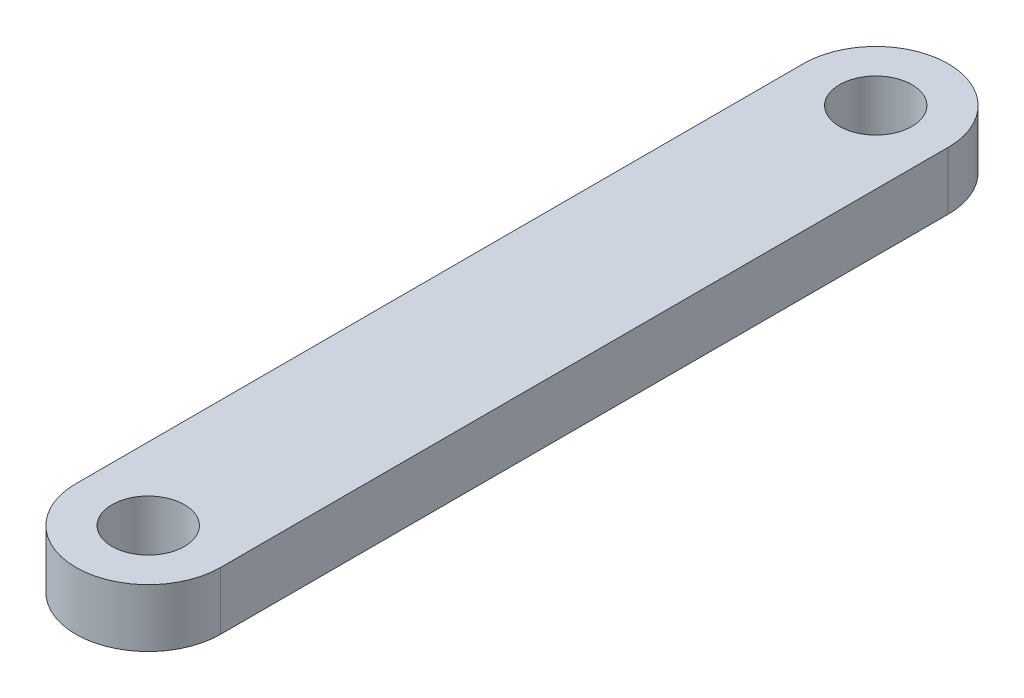
ISO-10303-21;
HEADER;
FILE_DESCRIPTION(('STEP AP214'),'2;1');
FILE_NAME('part.step','',(''),(''),'','','');
FILE_SCHEMA(('AUTOMOTIVE_DESIGN { 1 0 10303 214 1 1 1 1 }'));
ENDSEC;
DATA;
#1=APPLICATION_CONTEXT('core data for automotive mechanical design processes');
#2=APPLICATION_PROTOCOL_DEFINITION('international standard','automotive_design',2000,#1);
#3=PRODUCT_CONTEXT('',#1,'mechanical');
#4=PRODUCT('Part','Part','',(#3));
#5=PRODUCT_RELATED_PRODUCT_CATEGORY('part','',(#4));
#6=PRODUCT_DEFINITION_FORMATION('','',#4);
#7=PRODUCT_DEFINITION_CONTEXT('part definition',#1,'design');
#8=PRODUCT_DEFINITION('design','',#6,#7);
#9=PRODUCT_DEFINITION_SHAPE('','',#8);
#10=(LENGTH_UNIT() NAMED_UNIT(*) SI_UNIT(.MILLI.,.METRE.));
#11=(NAMED_UNIT(*) PLANE_ANGLE_UNIT() SI_UNIT($,.RADIAN.));
#12=(NAMED_UNIT(*) SI_UNIT($,.STERADIAN.) SOLID_ANGLE_UNIT());
#13=UNCERTAINTY_MEASURE_WITH_UNIT(LENGTH_MEASURE(1.E-05),#10,'distance_accuracy_value','');
#14=(GEOMETRIC_REPRESENTATION_CONTEXT(3) GLOBAL_UNCERTAINTY_ASSIGNED_CONTEXT((#13)) GLOBAL_UNIT_ASSIGNED_CONTEXT((#10,
#11,#12)) REPRESENTATION_CONTEXT('',''));
#15=CARTESIAN_POINT('',(0.,0.,0.));
#16=DIRECTION('',(0.,0.,1.));
#17=DIRECTION('',(1.,0.,0.));
#18=AXIS2_PLACEMENT_3D('',#15,#16,#17);
#19=CARTESIAN_POINT('',(0.,2.,0.));
#20=DIRECTION('',(0.,1.,0.));
#21=DIRECTION('',(0.,0.,1.));
#22=AXIS2_PLACEMENT_3D('',#19,#20,#21);
#23=PLANE('',#22);
#24=CARTESIAN_POINT('',(0.,2.,-25.11));
#25=DIRECTION('',(0.,1.,0.));
#26=DIRECTION('',(0.,0.,1.));
#27=AXIS2_PLACEMENT_3D('',#24,#25,#26);
#28=CIRCLE('',#27,1.25);
#29=CARTESIAN_POINT('',(0.,2.,-23.86));
#30=VERTEX_POINT('',#29);
#31=EDGE_CURVE('E103',#30,#30,#28,.T.);
#32=ORIENTED_EDGE('',*,*,#31,.F.);
#33=EDGE_LOOP('',(#32));
#34=FACE_BOUND('',#33,.T.);
#35=CARTESIAN_POINT('',(0.,2.,0.));
#36=DIRECTION('',(0.,1.,0.));
#37=DIRECTION('',(0.,0.,1.));
#38=AXIS2_PLACEMENT_3D('',#35,#36,#37);
#39=CIRCLE('',#38,2.5);
#40=CARTESIAN_POINT('',(-2.50000000000001,2.,0.));
#41=VERTEX_POINT('',#40);
#42=CARTESIAN_POINT('',(2.5,2.,0.));
#43=VERTEX_POINT('',#42);
#44=EDGE_CURVE('E87',#41,#43,#39,.T.);
#45=ORIENTED_EDGE('',*,*,#44,.T.);
#46=DIRECTION('',(0.,0.,-1.));
#47=VECTOR('',#46,1.);
#48=CARTESIAN_POINT('',(2.5,2.,-25.11));
#49=LINE('',#48,#47);
#50=CARTESIAN_POINT('',(2.5,2.,-25.11));
#51=VERTEX_POINT('',#50);
#52=EDGE_CURVE('E82',#43,#51,#49,.T.);
#53=ORIENTED_EDGE('',*,*,#52,.T.);
#54=CARTESIAN_POINT('',(0.,2.,-25.11));
#55=DIRECTION('',(0.,1.,0.));
#56=DIRECTION('',(0.,0.,1.));
#57=AXIS2_PLACEMENT_3D('',#54,#55,#56);
#58=CIRCLE('',#57,2.5);
#59=CARTESIAN_POINT('',(-2.5,2.,-25.11));
#60=VERTEX_POINT('',#59);
#61=EDGE_CURVE('E85',#51,#60,#58,.T.);
#62=ORIENTED_EDGE('',*,*,#61,.T.);
#63=DIRECTION('',(0.,0.,1.));
#64=VECTOR('',#63,1.);
#65=CARTESIAN_POINT('',(-2.50000000000001,2.,0.));
#66=LINE('',#65,#64);
#67=EDGE_CURVE('E52',#60,#41,#66,.T.);
#68=ORIENTED_EDGE('',*,*,#67,.T.);
#69=EDGE_LOOP('',(#45,#53,#62,#68));
#70=FACE_BOUND('',#69,.T.);
#71=CARTESIAN_POINT('',(0.,2.,0.));
#72=DIRECTION('',(0.,1.,0.));
#73=DIRECTION('',(0.,0.,1.));
#74=AXIS2_PLACEMENT_3D('',#71,#72,#73);
#75=CIRCLE('',#74,1.25000000000001);
#76=CARTESIAN_POINT('',(0.,2.,1.25000000000001));
#77=VERTEX_POINT('',#76);
#78=EDGE_CURVE('E113',#77,#77,#75,.T.);
#79=ORIENTED_EDGE('',*,*,#78,.F.);
#80=EDGE_LOOP('',(#79));
#81=FACE_BOUND('',#80,.T.);
#82=ADVANCED_FACE('F33',(#34,#70,#81),#23,.T.);
#83=CARTESIAN_POINT('',(0.,0.,0.));
#84=DIRECTION('',(0.,1.,0.));
#85=DIRECTION('',(0.,0.,1.));
#86=AXIS2_PLACEMENT_3D('',#83,#84,#85);
#87=PLANE('',#86);
#88=CARTESIAN_POINT('',(0.,0.,0.));
#89=DIRECTION('',(0.,1.,0.));
#90=DIRECTION('',(0.,0.,1.));
#91=AXIS2_PLACEMENT_3D('',#88,#89,#90);
#92=CIRCLE('',#91,2.5);
#93=CARTESIAN_POINT('',(-2.50000000000001,0.,0.));
#94=VERTEX_POINT('',#93);
#95=CARTESIAN_POINT('',(2.5,0.,0.));
#96=VERTEX_POINT('',#95);
#97=EDGE_CURVE('E100',#94,#96,#92,.T.);
#98=ORIENTED_EDGE('',*,*,#97,.F.);
#99=DIRECTION('',(0.,0.,1.));
#100=VECTOR('',#99,1.);
#101=CARTESIAN_POINT('',(-2.50000000000001,0.,0.));
#102=LINE('',#101,#100);
#103=CARTESIAN_POINT('',(-2.5,0.,-25.11));
#104=VERTEX_POINT('',#103);
#105=EDGE_CURVE('E75',#104,#94,#102,.T.);
#106=ORIENTED_EDGE('',*,*,#105,.F.);
#107=CARTESIAN_POINT('',(0.,0.,-25.11));
#108=DIRECTION('',(0.,1.,0.));
#109=DIRECTION('',(0.,0.,1.));
#110=AXIS2_PLACEMENT_3D('',#107,#108,#109);
#111=CIRCLE('',#110,2.5);
#112=CARTESIAN_POINT('',(2.5,0.,-25.11));
#113=VERTEX_POINT('',#112);
#114=EDGE_CURVE('E69',#113,#104,#111,.T.);
#115=ORIENTED_EDGE('',*,*,#114,.F.);
#116=DIRECTION('',(0.,0.,-1.));
#117=VECTOR('',#116,1.);
#118=CARTESIAN_POINT('',(2.5,0.,-25.11));
#119=LINE('',#118,#117);
#120=EDGE_CURVE('E91',#96,#113,#119,.T.);
#121=ORIENTED_EDGE('',*,*,#120,.F.);
#122=EDGE_LOOP('',(#98,#106,#115,#121));
#123=FACE_BOUND('',#122,.T.);
#124=CARTESIAN_POINT('',(0.,0.,-25.11));
#125=DIRECTION('',(0.,1.,0.));
#126=DIRECTION('',(0.,0.,1.));
#127=AXIS2_PLACEMENT_3D('',#124,#125,#126);
#128=CIRCLE('',#127,1.25);
#129=CARTESIAN_POINT('',(0.,0.,-23.86));
#130=VERTEX_POINT('',#129);
#131=EDGE_CURVE('E111',#130,#130,#128,.T.);
#132=ORIENTED_EDGE('',*,*,#131,.T.);
#133=EDGE_LOOP('',(#132));
#134=FACE_BOUND('',#133,.T.);
#135=CARTESIAN_POINT('',(0.,0.,0.));
#136=DIRECTION('',(0.,1.,0.));
#137=DIRECTION('',(0.,0.,1.));
#138=AXIS2_PLACEMENT_3D('',#135,#136,#137);
#139=CIRCLE('',#138,1.25000000000001);
#140=CARTESIAN_POINT('',(0.,0.,1.25000000000001));
#141=VERTEX_POINT('',#140);
#142=EDGE_CURVE('E37',#141,#141,#139,.T.);
#143=ORIENTED_EDGE('',*,*,#142,.T.);
#144=EDGE_LOOP('',(#143));
#145=FACE_BOUND('',#144,.T.);
#146=ADVANCED_FACE('F120',(#123,#134,#145),#87,.F.);
#147=CARTESIAN_POINT('',(0.,2.,0.));
#148=DIRECTION('',(0.,-1.,0.));
#149=DIRECTION('',(0.,0.,-1.));
#150=AXIS2_PLACEMENT_3D('',#147,#148,#149);
#151=CYLINDRICAL_SURFACE('',#150,2.5);
#152=ORIENTED_EDGE('',*,*,#97,.T.);
#153=DIRECTION('',(0.,-1.,0.));
#154=VECTOR('',#153,1.);
#155=CARTESIAN_POINT('',(2.5,2.,0.));
#156=LINE('',#155,#154);
#157=EDGE_CURVE('E12',#43,#96,#156,.T.);
#158=ORIENTED_EDGE('',*,*,#157,.F.);
#159=ORIENTED_EDGE('',*,*,#44,.F.);
#160=DIRECTION('',(0.,-1.,0.));
#161=VECTOR('',#160,1.);
#162=CARTESIAN_POINT('',(-2.50000000000001,2.,0.));
#163=LINE('',#162,#161);
#164=EDGE_CURVE('E96',#41,#94,#163,.T.);
#165=ORIENTED_EDGE('',*,*,#164,.T.);
#166=EDGE_LOOP('',(#152,#158,#159,#165));
#167=FACE_BOUND('',#166,.T.);
#168=ADVANCED_FACE('F135',(#167),#151,.T.);
#169=CARTESIAN_POINT('',(2.5,2.,-25.11));
#170=DIRECTION('',(-1.,0.,0.));
#171=DIRECTION('',(0.,0.,1.));
#172=AXIS2_PLACEMENT_3D('',#169,#170,#171);
#173=PLANE('',#172);
#174=ORIENTED_EDGE('',*,*,#120,.T.);
#175=DIRECTION('',(0.,-1.,0.));
#176=VECTOR('',#175,1.);
#177=CARTESIAN_POINT('',(2.5,2.,-25.11));
#178=LINE('',#177,#176);
#179=EDGE_CURVE('E43',#51,#113,#178,.T.);
#180=ORIENTED_EDGE('',*,*,#179,.F.);
#181=ORIENTED_EDGE('',*,*,#52,.F.);
#182=ORIENTED_EDGE('',*,*,#157,.T.);
#183=EDGE_LOOP('',(#174,#180,#181,#182));
#184=FACE_BOUND('',#183,.T.);
#185=ADVANCED_FACE('F90',(#184),#173,.F.);
#186=CARTESIAN_POINT('',(0.,2.,-25.11));
#187=DIRECTION('',(0.,-1.,0.));
#188=DIRECTION('',(0.,0.,-1.));
#189=AXIS2_PLACEMENT_3D('',#186,#187,#188);
#190=CYLINDRICAL_SURFACE('',#189,2.5);
#191=ORIENTED_EDGE('',*,*,#114,.T.);
#192=DIRECTION('',(0.,-1.,0.));
#193=VECTOR('',#192,1.);
#194=CARTESIAN_POINT('',(-2.5,2.,-25.11));
#195=LINE('',#194,#193);
#196=EDGE_CURVE('E92',#60,#104,#195,.T.);
#197=ORIENTED_EDGE('',*,*,#196,.F.);
#198=ORIENTED_EDGE('',*,*,#61,.F.);
#199=ORIENTED_EDGE('',*,*,#179,.T.);
#200=EDGE_LOOP('',(#191,#197,#198,#199));
#201=FACE_BOUND('',#200,.T.);
#202=ADVANCED_FACE('F94',(#201),#190,.T.);
#203=CARTESIAN_POINT('',(-2.50000000000001,2.,0.));
#204=DIRECTION('',(1.,0.,0.));
#205=DIRECTION('',(0.,0.,-1.));
#206=AXIS2_PLACEMENT_3D('',#203,#204,#205);
#207=PLANE('',#206);
#208=ORIENTED_EDGE('',*,*,#105,.T.);
#209=ORIENTED_EDGE('',*,*,#164,.F.);
#210=ORIENTED_EDGE('',*,*,#67,.F.);
#211=ORIENTED_EDGE('',*,*,#196,.T.);
#212=EDGE_LOOP('',(#208,#209,#210,#211));
#213=FACE_BOUND('',#212,.T.);
#214=ADVANCED_FACE('F127',(#213),#207,.F.);
#215=CARTESIAN_POINT('',(0.,2.,-25.11));
#216=DIRECTION('',(0.,-1.,0.));
#217=DIRECTION('',(0.,0.,-1.));
#218=AXIS2_PLACEMENT_3D('',#215,#216,#217);
#219=CYLINDRICAL_SURFACE('',#218,1.25);
#220=ORIENTED_EDGE('',*,*,#31,.T.);
#221=EDGE_LOOP('',(#220));
#222=FACE_BOUND('',#221,.T.);
#223=ORIENTED_EDGE('',*,*,#131,.F.);
#224=EDGE_LOOP('',(#223));
#225=FACE_BOUND('',#224,.T.);
#226=ADVANCED_FACE('F123',(#222,#225),#219,.F.);
#227=CARTESIAN_POINT('',(0.,2.,0.));
#228=DIRECTION('',(0.,-1.,0.));
#229=DIRECTION('',(0.,0.,-1.));
#230=AXIS2_PLACEMENT_3D('',#227,#228,#229);
#231=CYLINDRICAL_SURFACE('',#230,1.25000000000001);
#232=ORIENTED_EDGE('',*,*,#78,.T.);
#233=EDGE_LOOP('',(#232));
#234=FACE_BOUND('',#233,.T.);
#235=ORIENTED_EDGE('',*,*,#142,.F.);
#236=EDGE_LOOP('',(#235));
#237=FACE_BOUND('',#236,.T.);
#238=ADVANCED_FACE('F35',(#234,#237),#231,.F.);
#239=CLOSED_SHELL('',(#82,#146,#168,#185,#202,#214,#226,#238));
#240=MANIFOLD_SOLID_BREP('B2',#239);
#241=ADVANCED_BREP_SHAPE_REPRESENTATION('',(#18,#240),#14);
#242=SHAPE_DEFINITION_REPRESENTATION(#9,#241);
ENDSEC;
END-ISO-10303-21;
